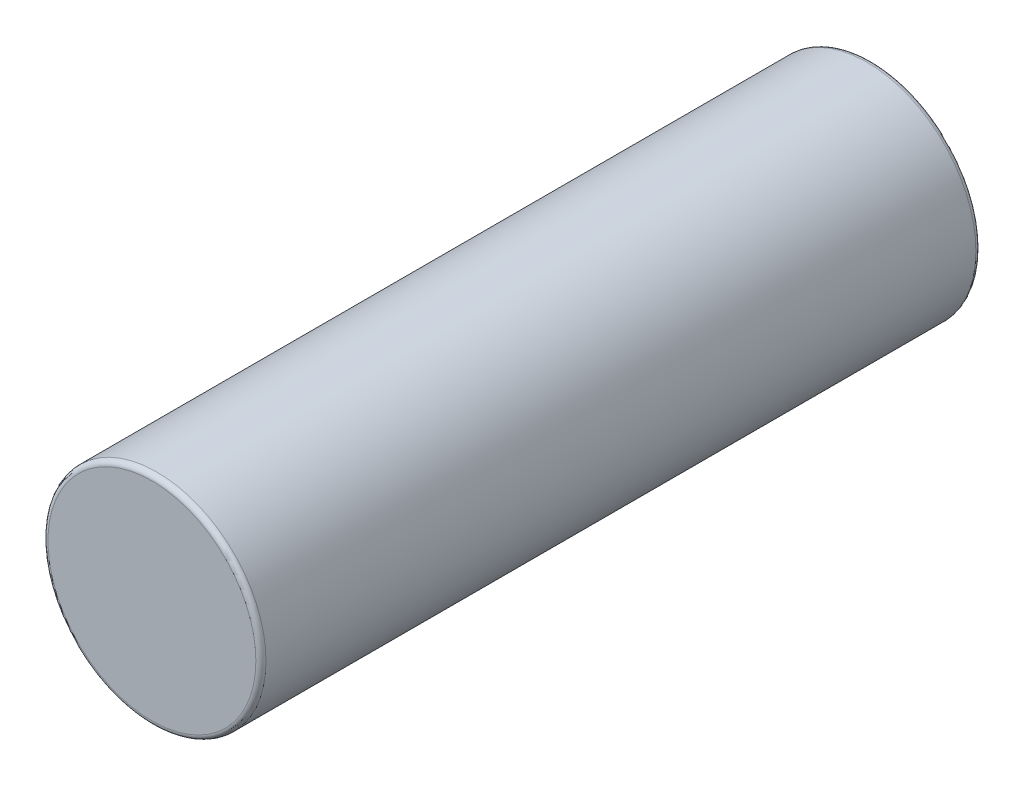
ISO-10303-21;
HEADER;
FILE_DESCRIPTION(('STEP AP214'),'2;1');
FILE_NAME('part.step','',(''),(''),'','','');
FILE_SCHEMA(('AUTOMOTIVE_DESIGN { 1 0 10303 214 1 1 1 1 }'));
ENDSEC;
DATA;
#1=APPLICATION_CONTEXT('core data for automotive mechanical design processes');
#2=APPLICATION_PROTOCOL_DEFINITION('international standard','automotive_design',2000,#1);
#3=PRODUCT_CONTEXT('',#1,'mechanical');
#4=PRODUCT('Part','Part','',(#3));
#5=PRODUCT_RELATED_PRODUCT_CATEGORY('part','',(#4));
#6=PRODUCT_DEFINITION_FORMATION('','',#4);
#7=PRODUCT_DEFINITION_CONTEXT('part definition',#1,'design');
#8=PRODUCT_DEFINITION('design','',#6,#7);
#9=PRODUCT_DEFINITION_SHAPE('','',#8);
#10=(LENGTH_UNIT() NAMED_UNIT(*) SI_UNIT(.MILLI.,.METRE.));
#11=(NAMED_UNIT(*) PLANE_ANGLE_UNIT() SI_UNIT($,.RADIAN.));
#12=(NAMED_UNIT(*) SI_UNIT($,.STERADIAN.) SOLID_ANGLE_UNIT());
#13=UNCERTAINTY_MEASURE_WITH_UNIT(LENGTH_MEASURE(1.E-05),#10,'distance_accuracy_value','');
#14=(GEOMETRIC_REPRESENTATION_CONTEXT(3) GLOBAL_UNCERTAINTY_ASSIGNED_CONTEXT((#13)) GLOBAL_UNIT_ASSIGNED_CONTEXT((#10,
#11,#12)) REPRESENTATION_CONTEXT('',''));
#15=CARTESIAN_POINT('',(0.,0.,0.));
#16=DIRECTION('',(0.,0.,1.));
#17=DIRECTION('',(1.,0.,0.));
#18=AXIS2_PLACEMENT_3D('',#15,#16,#17);
#19=CARTESIAN_POINT('',(156.432165940905,44.267111818908,71.));
#20=DIRECTION('',(0.,0.,-1.));
#21=DIRECTION('',(-1.,0.,0.));
#22=AXIS2_PLACEMENT_3D('',#19,#20,#21);
#23=CYLINDRICAL_SURFACE('',#22,10.75);
#24=CARTESIAN_POINT('',(156.432165940905,44.267111818908,0.5));
#25=DIRECTION('',(0.,0.,1.));
#26=DIRECTION('',(1.,0.,0.));
#27=AXIS2_PLACEMENT_3D('',#24,#25,#26);
#28=CIRCLE('',#27,10.75);
#29=CARTESIAN_POINT('',(167.182165940905,44.267111818908,0.5));
#30=VERTEX_POINT('',#29);
#31=EDGE_CURVE('E48',#30,#30,#28,.T.);
#32=ORIENTED_EDGE('',*,*,#31,.T.);
#33=EDGE_LOOP('',(#32));
#34=FACE_BOUND('',#33,.T.);
#35=CARTESIAN_POINT('',(156.432165940905,44.267111818908,70.5));
#36=DIRECTION('',(0.,0.,1.));
#37=DIRECTION('',(1.,0.,0.));
#38=AXIS2_PLACEMENT_3D('',#35,#36,#37);
#39=CIRCLE('',#38,10.75);
#40=CARTESIAN_POINT('',(167.182165940905,44.267111818908,70.5));
#41=VERTEX_POINT('',#40);
#42=EDGE_CURVE('E52',#41,#41,#39,.F.);
#43=ORIENTED_EDGE('',*,*,#42,.T.);
#44=EDGE_LOOP('',(#43));
#45=FACE_BOUND('',#44,.T.);
#46=ADVANCED_FACE('F37',(#34,#45),#23,.T.);
#47=CARTESIAN_POINT('',(156.432165940905,44.267111818908,71.));
#48=DIRECTION('',(0.,0.,1.));
#49=DIRECTION('',(1.,0.,0.));
#50=AXIS2_PLACEMENT_3D('',#47,#48,#49);
#51=PLANE('',#50);
#52=CARTESIAN_POINT('',(156.432165940905,44.267111818908,71.));
#53=DIRECTION('',(0.,0.,1.));
#54=DIRECTION('',(1.,0.,0.));
#55=AXIS2_PLACEMENT_3D('',#52,#53,#54);
#56=CIRCLE('',#55,10.25);
#57=CARTESIAN_POINT('',(166.682165940905,44.267111818908,71.));
#58=VERTEX_POINT('',#57);
#59=EDGE_CURVE('E10',#58,#58,#56,.T.);
#60=ORIENTED_EDGE('',*,*,#59,.T.);
#61=EDGE_LOOP('',(#60));
#62=FACE_BOUND('',#61,.T.);
#63=ADVANCED_FACE('F68',(#62),#51,.T.);
#64=CARTESIAN_POINT('',(156.432165940905,44.267111818908,0.));
#65=DIRECTION('',(0.,0.,1.));
#66=DIRECTION('',(1.,0.,0.));
#67=AXIS2_PLACEMENT_3D('',#64,#65,#66);
#68=PLANE('',#67);
#69=CARTESIAN_POINT('',(156.432165940905,44.267111818908,0.));
#70=DIRECTION('',(0.,0.,1.));
#71=DIRECTION('',(1.,0.,0.));
#72=AXIS2_PLACEMENT_3D('',#69,#70,#71);
#73=CIRCLE('',#72,10.25);
#74=CARTESIAN_POINT('',(166.682165940905,44.267111818908,0.));
#75=VERTEX_POINT('',#74);
#76=EDGE_CURVE('E44',#75,#75,#73,.F.);
#77=ORIENTED_EDGE('',*,*,#76,.T.);
#78=EDGE_LOOP('',(#77));
#79=FACE_BOUND('',#78,.T.);
#80=ADVANCED_FACE('F65',(#79),#68,.F.);
#81=CARTESIAN_POINT('',(156.432165940905,44.267111818908,0.5));
#82=DIRECTION('',(0.,0.,1.));
#83=DIRECTION('',(1.,0.,0.));
#84=AXIS2_PLACEMENT_3D('',#81,#82,#83);
#85=TOROIDAL_SURFACE('',#84,10.25,0.5);
#86=ORIENTED_EDGE('',*,*,#76,.F.);
#87=EDGE_LOOP('',(#86));
#88=FACE_BOUND('',#87,.T.);
#89=ORIENTED_EDGE('',*,*,#31,.F.);
#90=EDGE_LOOP('',(#89));
#91=FACE_BOUND('',#90,.T.);
#92=ADVANCED_FACE('F61',(#88,#91),#85,.T.);
#93=CARTESIAN_POINT('',(156.432165940905,44.267111818908,70.5));
#94=DIRECTION('',(0.,0.,1.));
#95=DIRECTION('',(1.,0.,0.));
#96=AXIS2_PLACEMENT_3D('',#93,#94,#95);
#97=TOROIDAL_SURFACE('',#96,10.25,0.5);
#98=ORIENTED_EDGE('',*,*,#42,.F.);
#99=EDGE_LOOP('',(#98));
#100=FACE_BOUND('',#99,.T.);
#101=ORIENTED_EDGE('',*,*,#59,.F.);
#102=EDGE_LOOP('',(#101));
#103=FACE_BOUND('',#102,.T.);
#104=ADVANCED_FACE('F39',(#100,#103),#97,.T.);
#105=CLOSED_SHELL('',(#46,#63,#80,#92,#104));
#106=MANIFOLD_SOLID_BREP('B2',#105);
#107=ADVANCED_BREP_SHAPE_REPRESENTATION('',(#18,#106),#14);
#108=SHAPE_DEFINITION_REPRESENTATION(#9,#107);
ENDSEC;
END-ISO-10303-21;
